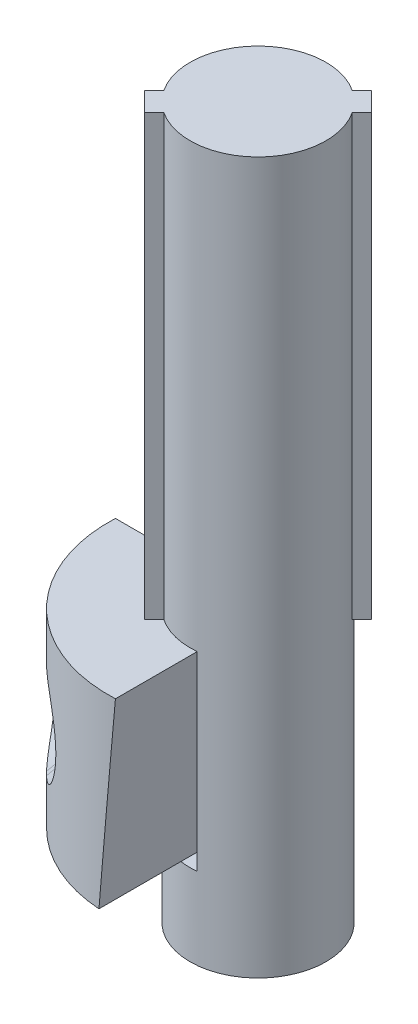
ISO-10303-21;
HEADER;
FILE_DESCRIPTION(('STEP AP214'),'2;1');
FILE_NAME('part.step','',(''),(''),'','','');
FILE_SCHEMA(('AUTOMOTIVE_DESIGN { 1 0 10303 214 1 1 1 1 }'));
ENDSEC;
DATA;
#1=APPLICATION_CONTEXT('core data for automotive mechanical design processes');
#2=APPLICATION_PROTOCOL_DEFINITION('international standard','automotive_design',2000,#1);
#3=PRODUCT_CONTEXT('',#1,'mechanical');
#4=PRODUCT('Part','Part','',(#3));
#5=PRODUCT_RELATED_PRODUCT_CATEGORY('part','',(#4));
#6=PRODUCT_DEFINITION_FORMATION('','',#4);
#7=PRODUCT_DEFINITION_CONTEXT('part definition',#1,'design');
#8=PRODUCT_DEFINITION('design','',#6,#7);
#9=PRODUCT_DEFINITION_SHAPE('','',#8);
#10=(LENGTH_UNIT() NAMED_UNIT(*) SI_UNIT(.MILLI.,.METRE.));
#11=(NAMED_UNIT(*) PLANE_ANGLE_UNIT() SI_UNIT($,.RADIAN.));
#12=(NAMED_UNIT(*) SI_UNIT($,.STERADIAN.) SOLID_ANGLE_UNIT());
#13=UNCERTAINTY_MEASURE_WITH_UNIT(LENGTH_MEASURE(1.E-05),#10,'distance_accuracy_value','');
#14=(GEOMETRIC_REPRESENTATION_CONTEXT(3) GLOBAL_UNCERTAINTY_ASSIGNED_CONTEXT((#13)) GLOBAL_UNIT_ASSIGNED_CONTEXT((#10,
#11,#12)) REPRESENTATION_CONTEXT('',''));
#15=CARTESIAN_POINT('',(0.,0.,0.));
#16=DIRECTION('',(0.,0.,1.));
#17=DIRECTION('',(1.,0.,0.));
#18=AXIS2_PLACEMENT_3D('',#15,#16,#17);
#19=CARTESIAN_POINT('',(5.5,15.,-5.5));
#20=DIRECTION('',(0.,-1.,0.));
#21=DIRECTION('',(0.,0.,-1.));
#22=AXIS2_PLACEMENT_3D('',#19,#20,#21);
#23=CYLINDRICAL_SURFACE('',#22,2.5);
#24=CARTESIAN_POINT('',(5.5,11.15,-5.5));
#25=DIRECTION('',(0.,1.,0.));
#26=DIRECTION('',(0.,0.,1.));
#27=AXIS2_PLACEMENT_3D('',#24,#25,#26);
#28=CIRCLE('',#27,2.5);
#29=CARTESIAN_POINT('',(6.87849741697561,11.15,-7.58560419816214));
#30=VERTEX_POINT('',#29);
#31=CARTESIAN_POINT('',(3.41439580183784,11.15,-4.12150258302441));
#32=VERTEX_POINT('',#31);
#33=EDGE_CURVE('E361',#30,#32,#28,.T.);
#34=ORIENTED_EDGE('',*,*,#33,.F.);
#35=DIRECTION('',(0.,1.,0.));
#36=VECTOR('',#35,1.);
#37=CARTESIAN_POINT('',(6.87849741697561,-6.50000000000001,-7.58560419816214));
#38=LINE('',#37,#36);
#39=CARTESIAN_POINT('',(6.87849741697561,-5.,-7.58560419816214));
#40=VERTEX_POINT('',#39);
#41=EDGE_CURVE('E335',#40,#30,#38,.T.);
#42=ORIENTED_EDGE('',*,*,#41,.F.);
#43=CARTESIAN_POINT('',(5.5,-5.,-5.5));
#44=DIRECTION('',(0.,1.,0.));
#45=DIRECTION('',(0.,0.,1.));
#46=AXIS2_PLACEMENT_3D('',#43,#44,#45);
#47=CIRCLE('',#46,2.5);
#48=CARTESIAN_POINT('',(7.58560419816216,-5.,-6.8784974169756));
#49=VERTEX_POINT('',#48);
#50=EDGE_CURVE('E337',#40,#49,#47,.F.);
#51=ORIENTED_EDGE('',*,*,#50,.T.);
#52=DIRECTION('',(0.,1.,0.));
#53=VECTOR('',#52,1.);
#54=CARTESIAN_POINT('',(7.58560419816216,-6.50000000000001,-6.8784974169756));
#55=LINE('',#54,#53);
#56=CARTESIAN_POINT('',(7.58560419816216,11.15,-6.8784974169756));
#57=VERTEX_POINT('',#56);
#58=EDGE_CURVE('E346',#49,#57,#55,.T.);
#59=ORIENTED_EDGE('',*,*,#58,.T.);
#60=CARTESIAN_POINT('',(4.12150258302438,11.15,-3.41439580183786));
#61=VERTEX_POINT('',#60);
#62=EDGE_CURVE('E382',#61,#57,#28,.T.);
#63=ORIENTED_EDGE('',*,*,#62,.F.);
#64=DIRECTION('',(0.,1.,0.));
#65=VECTOR('',#64,1.);
#66=CARTESIAN_POINT('',(4.12150258302438,-6.50000000000001,-3.41439580183786));
#67=LINE('',#66,#65);
#68=CARTESIAN_POINT('',(4.12150258302438,-5.,-3.41439580183786));
#69=VERTEX_POINT('',#68);
#70=EDGE_CURVE('E374',#69,#61,#67,.T.);
#71=ORIENTED_EDGE('',*,*,#70,.F.);
#72=CARTESIAN_POINT('',(5.5,-5.,-5.5));
#73=DIRECTION('',(0.,1.,0.));
#74=DIRECTION('',(0.,0.,1.));
#75=AXIS2_PLACEMENT_3D('',#72,#73,#74);
#76=CIRCLE('',#75,2.5);
#77=CARTESIAN_POINT('',(5.75,-5.,-3.01253140723345));
#78=VERTEX_POINT('',#77);
#79=EDGE_CURVE('E427',#69,#78,#76,.T.);
#80=ORIENTED_EDGE('',*,*,#79,.T.);
#81=DIRECTION('',(0.,-1.,0.));
#82=VECTOR('',#81,1.);
#83=CARTESIAN_POINT('',(5.75,15.,-3.01253140723345));
#84=LINE('',#83,#82);
#85=CARTESIAN_POINT('',(5.75,-12.,-3.01253140723345));
#86=VERTEX_POINT('',#85);
#87=EDGE_CURVE('E440',#78,#86,#84,.T.);
#88=ORIENTED_EDGE('',*,*,#87,.T.);
#89=CARTESIAN_POINT('',(5.5,-12.,-5.5));
#90=DIRECTION('',(0.,1.,0.));
#91=DIRECTION('',(0.,0.,1.));
#92=AXIS2_PLACEMENT_3D('',#89,#90,#91);
#93=CIRCLE('',#92,2.5);
#94=CARTESIAN_POINT('',(5.13757935531858,-12.,-3.0264092342692));
#95=VERTEX_POINT('',#94);
#96=EDGE_CURVE('E421',#95,#86,#93,.T.);
#97=ORIENTED_EDGE('',*,*,#96,.F.);
#98=CARTESIAN_POINT('',(3.02640923426919,-12.,-5.13757935531858));
#99=VERTEX_POINT('',#98);
#100=EDGE_CURVE('E425',#99,#95,#93,.T.);
#101=ORIENTED_EDGE('',*,*,#100,.F.);
#102=CARTESIAN_POINT('',(3.01253140723345,-12.,-5.75));
#103=VERTEX_POINT('',#102);
#104=EDGE_CURVE('E422',#103,#99,#93,.T.);
#105=ORIENTED_EDGE('',*,*,#104,.F.);
#106=DIRECTION('',(0.,-1.,0.));
#107=VECTOR('',#106,1.);
#108=CARTESIAN_POINT('',(3.01253140723345,15.,-5.75));
#109=LINE('',#108,#107);
#110=CARTESIAN_POINT('',(3.01253140723345,-5.,-5.75));
#111=VERTEX_POINT('',#110);
#112=EDGE_CURVE('E443',#111,#103,#109,.T.);
#113=ORIENTED_EDGE('',*,*,#112,.F.);
#114=CARTESIAN_POINT('',(3.41439580183784,-5.,-4.12150258302441));
#115=VERTEX_POINT('',#114);
#116=EDGE_CURVE('E428',#111,#115,#76,.T.);
#117=ORIENTED_EDGE('',*,*,#116,.T.);
#118=DIRECTION('',(0.,1.,0.));
#119=VECTOR('',#118,1.);
#120=CARTESIAN_POINT('',(3.41439580183784,-6.50000000000001,-4.12150258302441));
#121=LINE('',#120,#119);
#122=EDGE_CURVE('E371',#115,#32,#121,.T.);
#123=ORIENTED_EDGE('',*,*,#122,.T.);
#124=EDGE_LOOP('',(#34,#42,#51,#59,#63,#71,#80,#88,#97,#101,#105,#113,#117,#123));
#125=FACE_BOUND('',#124,.T.);
#126=CARTESIAN_POINT('',(5.5,-15.,-5.5));
#127=DIRECTION('',(0.,1.,0.));
#128=DIRECTION('',(0.,0.,1.));
#129=AXIS2_PLACEMENT_3D('',#126,#127,#128);
#130=CIRCLE('',#129,2.5);
#131=CARTESIAN_POINT('',(5.5,-15.,-3.));
#132=VERTEX_POINT('',#131);
#133=EDGE_CURVE('E437',#132,#132,#130,.T.);
#134=ORIENTED_EDGE('',*,*,#133,.T.);
#135=EDGE_LOOP('',(#134));
#136=FACE_BOUND('',#135,.T.);
#137=ADVANCED_FACE('F115',(#125,#136),#23,.T.);
#138=CARTESIAN_POINT('',(5.5,-5.,-5.5));
#139=DIRECTION('',(0.,1.,0.));
#140=DIRECTION('',(0.,0.,1.));
#141=AXIS2_PLACEMENT_3D('',#138,#139,#140);
#142=PLANE('',#141);
#143=ORIENTED_EDGE('',*,*,#79,.F.);
#144=DIRECTION('',(0.707106781186545,0.,-0.707106781186551));
#145=VECTOR('',#144,1.);
#146=CARTESIAN_POINT('',(0.353553390593281,-5.,0.353553390593278));
#147=LINE('',#146,#145);
#148=CARTESIAN_POINT('',(3.76794919243111,-5.,-3.06084241124458));
#149=VERTEX_POINT('',#148);
#150=EDGE_CURVE('E356',#149,#69,#147,.T.);
#151=ORIENTED_EDGE('',*,*,#150,.F.);
#152=DIRECTION('',(0.707106781186545,0.,0.70710678118655));
#153=VECTOR('',#152,1.);
#154=CARTESIAN_POINT('',(3.41439580183786,-5.,-3.41439580183784));
#155=LINE('',#154,#153);
#156=CARTESIAN_POINT('',(3.06084241124457,-5.,-3.76794919243114));
#157=VERTEX_POINT('',#156);
#158=EDGE_CURVE('E359',#157,#149,#155,.T.);
#159=ORIENTED_EDGE('',*,*,#158,.F.);
#160=DIRECTION('',(-0.707106781186554,0.,0.707106781186541));
#161=VECTOR('',#160,1.);
#162=CARTESIAN_POINT('',(-0.353553390593315,-5.,-0.353553390593322));
#163=LINE('',#162,#161);
#164=EDGE_CURVE('E358',#115,#157,#163,.T.);
#165=ORIENTED_EDGE('',*,*,#164,.F.);
#166=ORIENTED_EDGE('',*,*,#116,.F.);
#167=DIRECTION('',(1.,0.,0.));
#168=VECTOR('',#167,1.);
#169=CARTESIAN_POINT('',(0.,-5.,-5.75));
#170=LINE('',#169,#168);
#171=CARTESIAN_POINT('',(0.00568475604102465,-5.,-5.75));
#172=VERTEX_POINT('',#171);
#173=EDGE_CURVE('E434',#172,#111,#170,.T.);
#174=ORIENTED_EDGE('',*,*,#173,.F.);
#175=CARTESIAN_POINT('',(5.5,-5.,-5.5));
#176=DIRECTION('',(0.,1.,0.));
#177=DIRECTION('',(0.,0.,1.));
#178=AXIS2_PLACEMENT_3D('',#175,#176,#177);
#179=CIRCLE('',#178,5.5);
#180=CARTESIAN_POINT('',(5.75,-5.,-0.00568475604102378));
#181=VERTEX_POINT('',#180);
#182=EDGE_CURVE('E431',#172,#181,#179,.T.);
#183=ORIENTED_EDGE('',*,*,#182,.T.);
#184=DIRECTION('',(0.,0.,1.));
#185=VECTOR('',#184,1.);
#186=CARTESIAN_POINT('',(5.75,-5.,0.));
#187=LINE('',#186,#185);
#188=EDGE_CURVE('E445',#78,#181,#187,.T.);
#189=ORIENTED_EDGE('',*,*,#188,.F.);
#190=EDGE_LOOP('',(#143,#151,#159,#165,#166,#174,#183,#189));
#191=FACE_BOUND('',#190,.T.);
#192=ADVANCED_FACE('F552',(#191),#142,.T.);
#193=CARTESIAN_POINT('',(5.5,15.,-5.5));
#194=DIRECTION('',(0.,-1.,0.));
#195=DIRECTION('',(0.,0.,-1.));
#196=AXIS2_PLACEMENT_3D('',#193,#194,#195);
#197=CYLINDRICAL_SURFACE('',#196,5.5);
#198=CARTESIAN_POINT('',(1.51914962825792,-10.2335739899343,-1.70489389900612));
#199=CARTESIAN_POINT('',(1.5441505561346,-10.2392834913056,-1.67866659017602));
#200=CARTESIAN_POINT('',(1.56956531516001,-10.2434981877934,-1.65253034782335));
#201=CARTESIAN_POINT('',(1.62106490100953,-10.248905909692,-1.60061586626911));
#202=CARTESIAN_POINT('',(1.64714962759526,-10.2500993844985,-1.57483757439111));
#203=CARTESIAN_POINT('',(1.72593792711982,-10.2491048900861,-1.49852979415537));
#204=CARTESIAN_POINT('',(1.77941182021492,-10.2423957364861,-1.44877946281233));
#205=CARTESIAN_POINT('',(1.88668818475838,-10.217262973803,-1.35281149269449));
#206=CARTESIAN_POINT('',(1.94049063341472,-10.1988401683598,-1.30659361181208));
#207=CARTESIAN_POINT('',(2.04691792161581,-10.1512250764264,-1.21852814327765));
#208=CARTESIAN_POINT('',(2.09954200447221,-10.1220260690895,-1.17668330392498));
#209=CARTESIAN_POINT('',(2.20500909366872,-10.0522463652033,-1.0957181059729));
#210=CARTESIAN_POINT('',(2.25770644418136,-10.0111301977817,-1.05687221064815));
#211=CARTESIAN_POINT('',(2.35890999965567,-9.91986073930077,-0.984756598830602));
#212=CARTESIAN_POINT('',(2.40741402337676,-9.86970278633317,-0.951489776045761));
#213=CARTESIAN_POINT('',(2.50526178245831,-9.75466441146884,-0.886385002252893));
#214=CARTESIAN_POINT('',(2.55386260313672,-9.68871353776413,-0.855322657752768));
#215=CARTESIAN_POINT('',(2.64309675175275,-9.54906945821547,-0.799907720908033));
#216=CARTESIAN_POINT('',(2.68372632365317,-9.47537262748837,-0.775558289496097));
#217=CARTESIAN_POINT('',(2.76065414543683,-9.31214534820572,-0.730489816543813));
#218=CARTESIAN_POINT('',(2.79572905154928,-9.22179631965473,-0.71063658828263));
#219=CARTESIAN_POINT('',(2.85330770588625,-9.03588251331754,-0.67857820036165));
#220=CARTESIAN_POINT('',(2.87580742387453,-8.94031607415666,-0.666375492473373));
#221=CARTESIAN_POINT('',(2.90844059972597,-8.74018813291337,-0.648794415806305));
#222=CARTESIAN_POINT('',(2.91770043453417,-8.63544030745314,-0.643897299342392));
#223=CARTESIAN_POINT('',(2.92070452228868,-8.42565891314713,-0.642301352077756));
#224=CARTESIAN_POINT('',(2.91444733893316,-8.32062531874862,-0.645603280205278));
#225=CARTESIAN_POINT('',(2.88653624434314,-8.11211343729197,-0.660572485449301));
#226=CARTESIAN_POINT('',(2.8647235454944,-8.00866252399031,-0.672326045521924));
#227=CARTESIAN_POINT('',(2.806409368662,-7.80739005351634,-0.704619575411203));
#228=CARTESIAN_POINT('',(2.76990463497622,-7.7095697495621,-0.725161492759852));
#229=CARTESIAN_POINT('',(2.68386440163536,-7.52314989229976,-0.775400509268755));
#230=CARTESIAN_POINT('',(2.63441391126067,-7.43449526375924,-0.805038092132545));
#231=CARTESIAN_POINT('',(2.52411359827292,-7.26879443998814,-0.874167995886463));
#232=CARTESIAN_POINT('',(2.46326506441473,-7.19174693413775,-0.913659202813715));
#233=CARTESIAN_POINT('',(2.33654741312632,-7.05714505905393,-1.00021400074501));
#234=CARTESIAN_POINT('',(2.27123044693211,-6.9986728086022,-1.04664938640178));
#235=CARTESIAN_POINT('',(2.13511253629451,-6.89833641348128,-1.14859693861243));
#236=CARTESIAN_POINT('',(2.06431898326498,-6.8564503352752,-1.20409697988086));
#237=CARTESIAN_POINT('',(1.93090929832068,-6.7969690332752,-1.31455008805665));
#238=CARTESIAN_POINT('',(1.86857776648569,-6.77675033626925,-1.36843844380228));
#239=CARTESIAN_POINT('',(1.74482722089092,-6.75217578223954,-1.4805975427642));
#240=CARTESIAN_POINT('',(1.68340642668508,-6.74778326014308,-1.53885783698613));
#241=CARTESIAN_POINT('',(1.60594980865659,-6.75252516270229,-1.6157994927089));
#242=CARTESIAN_POINT('',(1.58833074268475,-6.75432677551555,-1.63354547723863));
#243=CARTESIAN_POINT('',(1.55346265189526,-6.75933228402285,-1.66914402065434));
#244=CARTESIAN_POINT('',(1.536213057813,-6.76253383091712,-1.68699635183818));
#245=CARTESIAN_POINT('',(1.51914962825792,-6.76642601006575,-1.70489389900612));
#246=B_SPLINE_CURVE_WITH_KNOTS('',3,(#198,#199,#200,#201,#202,#203,#204,#205,#206,#207,#208,
#209,#210,#211,#212,#213,#214,#215,#216,#217,#218,#219,#220,#221,#222,#223,#224,#225,#226,#227,
#228,#229,#230,#231,#232,#233,#234,#235,#236,#237,#238,#239,#240,#241,#242,#243,#244,#245),
.UNSPECIFIED.,.F.,.F.,(4,2,2,2,2,2,2,2,2,2,2,2,2,2,2,2,2,2,2,2,2,2,2,4),(0.,0.109979061343247,
0.219941762743246,0.438840845557283,0.657724911955656,0.876745722182427,1.10775388751094,
1.33888150217557,1.6006840341744,1.86260963230181,2.15811962417806,2.45372427015605,
2.76805399604422,3.08241281832241,3.40002734982218,3.71771230234662,4.03336131417142,
4.34897465768872,4.64484529497772,4.94032335606108,5.19339395243985,5.44587787264425,
5.52106498005335,5.59612642020038),.UNSPECIFIED.);
#247=CARTESIAN_POINT('',(1.68226625907396,-10.2496010911638,-1.54084490283661));
#248=VERTEX_POINT('',#247);
#249=CARTESIAN_POINT('',(1.68226625907396,-6.75039890883617,-1.54084490283661));
#250=VERTEX_POINT('',#249);
#251=EDGE_CURVE('E13',#248,#250,#246,.T.);
#252=ORIENTED_EDGE('',*,*,#251,.F.);
#253=CARTESIAN_POINT('',(5.5,-4.75051025721682,-5.5));
#254=DIRECTION('',(0.499999999999988,-0.707106781186548,-0.500000000000012));
#255=DIRECTION('',(-0.499999999999988,-0.707106781186547,0.500000000000012));
#256=AXIS2_PLACEMENT_3D('',#253,#254,#255);
#257=ELLIPSE('',#256,7.77817459305202,5.5);
#258=CARTESIAN_POINT('',(1.54084490283665,-10.2496010911638,-1.68226625907391));
#259=VERTEX_POINT('',#258);
#260=EDGE_CURVE('E457',#259,#248,#257,.F.);
#261=ORIENTED_EDGE('',*,*,#260,.F.);
#262=CARTESIAN_POINT('',(1.70489389900617,-6.76642601006574,-1.51914962825787));
#263=CARTESIAN_POINT('',(1.67866659017607,-6.76071650869439,-1.54415055613455));
#264=CARTESIAN_POINT('',(1.6525303478234,-6.75650181220663,-1.56956531515997));
#265=CARTESIAN_POINT('',(1.60061586626916,-6.75109409030798,-1.62106490100948));
#266=CARTESIAN_POINT('',(1.57483757439116,-6.74990061550146,-1.64714962759521));
#267=CARTESIAN_POINT('',(1.49852979415542,-6.7508951099139,-1.72593792711977));
#268=CARTESIAN_POINT('',(1.44877946281238,-6.75760426351392,-1.77941182021487));
#269=CARTESIAN_POINT('',(1.35281149269453,-6.78273702619702,-1.88668818475833));
#270=CARTESIAN_POINT('',(1.30659361181213,-6.80115983164018,-1.94049063341466));
#271=CARTESIAN_POINT('',(1.21852814327769,-6.84877492357363,-2.04691792161576));
#272=CARTESIAN_POINT('',(1.17668330392502,-6.87797393091055,-2.09954200447216));
#273=CARTESIAN_POINT('',(1.09571810597295,-6.94775363479675,-2.20500909366866));
#274=CARTESIAN_POINT('',(1.05687221064819,-6.98886980221838,-2.2577064441813));
#275=CARTESIAN_POINT('',(0.984756598830643,-7.08013926069927,-2.35890999965561));
#276=CARTESIAN_POINT('',(0.951489776045803,-7.13029721366687,-2.4074140233767));
#277=CARTESIAN_POINT('',(0.886385002252934,-7.24533558853121,-2.50526178245825));
#278=CARTESIAN_POINT('',(0.855322657752807,-7.31128646223591,-2.55386260313666));
#279=CARTESIAN_POINT('',(0.799907720908071,-7.45093054178458,-2.64309675175268));
#280=CARTESIAN_POINT('',(0.775558289496135,-7.52462737251169,-2.68372632365311));
#281=CARTESIAN_POINT('',(0.730489816543853,-7.68785465179435,-2.76065414543676));
#282=CARTESIAN_POINT('',(0.710636588282672,-7.77820368034534,-2.79572905154921));
#283=CARTESIAN_POINT('',(0.678578200361693,-7.96411748668254,-2.85330770588617));
#284=CARTESIAN_POINT('',(0.666375492473416,-8.05968392584342,-2.87580742387445));
#285=CARTESIAN_POINT('',(0.64879441580635,-8.25981186708671,-2.90844059972588));
#286=CARTESIAN_POINT('',(0.64389729934244,-8.36455969254693,-2.91770043453408));
#287=CARTESIAN_POINT('',(0.642301352077808,-8.57434108685295,-2.92070452228858));
#288=CARTESIAN_POINT('',(0.645603280205331,-8.67937468125146,-2.91444733893306));
#289=CARTESIAN_POINT('',(0.66057248544936,-8.8878865627081,-2.88653624434303));
#290=CARTESIAN_POINT('',(0.672326045521985,-8.99133747600976,-2.86472354549429));
#291=CARTESIAN_POINT('',(0.704619575411269,-9.19260994648372,-2.80640936866188));
#292=CARTESIAN_POINT('',(0.72516149275992,-9.29043025043796,-2.7699046349761));
#293=CARTESIAN_POINT('',(0.775400509268828,-9.47685010770029,-2.68386440163524));
#294=CARTESIAN_POINT('',(0.80503809213262,-9.56550473624081,-2.63441391126054));
#295=CARTESIAN_POINT('',(0.874167995886544,-9.73120556001191,-2.52411359827279));
#296=CARTESIAN_POINT('',(0.9136592028138,-9.80825306586229,-2.4632650644146));
#297=CARTESIAN_POINT('',(1.0002140007451,-9.9428549409461,-2.33654741312619));
#298=CARTESIAN_POINT('',(1.04664938640187,-10.0013271913978,-2.27123044693198));
#299=CARTESIAN_POINT('',(1.14859693861253,-10.1016635865187,-2.13511253629438));
#300=CARTESIAN_POINT('',(1.20409697988096,-10.1435496647248,-2.06431898326485));
#301=CARTESIAN_POINT('',(1.31455008805676,-10.2030309667248,-1.93090929832056));
#302=CARTESIAN_POINT('',(1.36843844380239,-10.2232496637308,-1.86857776648557));
#303=CARTESIAN_POINT('',(1.48059754276431,-10.2478242177605,-1.7448272208908));
#304=CARTESIAN_POINT('',(1.53885783698625,-10.2522167398569,-1.68340642668497));
#305=CARTESIAN_POINT('',(1.615799492709,-10.2474748372977,-1.60594980865649));
#306=CARTESIAN_POINT('',(1.63354547723872,-10.2456732244844,-1.58833074268466));
#307=CARTESIAN_POINT('',(1.66914402065441,-10.2406677159772,-1.55346265189519));
#308=CARTESIAN_POINT('',(1.68699635183824,-10.2374661690829,-1.53621305781294));
#309=CARTESIAN_POINT('',(1.70489389900617,-10.2335739899343,-1.51914962825787));
#310=B_SPLINE_CURVE_WITH_KNOTS('',3,(#262,#263,#264,#265,#266,#267,#268,#269,#270,#271,#272,
#273,#274,#275,#276,#277,#278,#279,#280,#281,#282,#283,#284,#285,#286,#287,#288,#289,#290,#291,
#292,#293,#294,#295,#296,#297,#298,#299,#300,#301,#302,#303,#304,#305,#306,#307,#308,#309),
.UNSPECIFIED.,.F.,.F.,(4,2,2,2,2,2,2,2,2,2,2,2,2,2,2,2,2,2,2,2,2,2,2,4),(0.,0.109979061343247,
0.219941762743246,0.438840845557284,0.657724911955657,0.87674572218243,1.10775388751094,
1.33888150217558,1.60068403417441,1.86260963230183,2.15811962417809,2.45372427015608,
2.76805399604425,3.08241281832244,3.4000273498222,3.71771230234664,4.03336131417143,
4.34897465768873,4.64484529497773,4.94032335606109,5.19339395243985,5.44587787264425,
5.52106498005331,5.5961264202003),.UNSPECIFIED.);
#311=CARTESIAN_POINT('',(1.54084490283665,-6.75039890883618,-1.68226625907391));
#312=VERTEX_POINT('',#311);
#313=EDGE_CURVE('E450',#312,#259,#310,.T.);
#314=ORIENTED_EDGE('',*,*,#313,.F.);
#315=CARTESIAN_POINT('',(5.5,-12.2494897427832,-5.5));
#316=DIRECTION('',(-0.499999999999988,-0.707106781186548,0.500000000000012));
#317=DIRECTION('',(0.499999999999988,-0.707106781186547,-0.500000000000012));
#318=AXIS2_PLACEMENT_3D('',#315,#316,#317);
#319=ELLIPSE('',#318,7.77817459305202,5.5);
#320=EDGE_CURVE('E127',#312,#250,#319,.F.);
#321=ORIENTED_EDGE('',*,*,#320,.T.);
#322=EDGE_LOOP('',(#252,#261,#314,#321));
#323=FACE_BOUND('',#322,.T.);
#324=CARTESIAN_POINT('',(5.5,-7.85751307569057,-5.5));
#325=DIRECTION('',(0.,0.0871557427476513,0.996194698091746));
#326=DIRECTION('',(0.,-0.996194698091746,0.0871557427476513));
#327=AXIS2_PLACEMENT_3D('',#324,#325,#326);
#328=ELLIPSE('',#327,63.1054228511892,5.5);
#329=CARTESIAN_POINT('',(0.011953783329746,-12.,-5.13757935531858));
#330=VERTEX_POINT('',#329);
#331=EDGE_CURVE('E401',#330,#172,#328,.F.);
#332=ORIENTED_EDGE('',*,*,#331,.F.);
#333=CARTESIAN_POINT('',(5.5,-12.,-5.5));
#334=DIRECTION('',(0.,1.,0.));
#335=DIRECTION('',(0.,0.,1.));
#336=AXIS2_PLACEMENT_3D('',#333,#334,#335);
#337=CIRCLE('',#336,5.5);
#338=CARTESIAN_POINT('',(5.13757935531858,-12.,-0.0119537833297451));
#339=VERTEX_POINT('',#338);
#340=EDGE_CURVE('E424',#330,#339,#337,.T.);
#341=ORIENTED_EDGE('',*,*,#340,.T.);
#342=CARTESIAN_POINT('',(5.5,-7.85751307569059,-5.5));
#343=DIRECTION('',(0.996194698091746,-0.0871557427476513,0.));
#344=DIRECTION('',(-0.0871557427476513,-0.996194698091746,0.));
#345=AXIS2_PLACEMENT_3D('',#342,#343,#344);
#346=ELLIPSE('',#345,63.1054228511892,5.5);
#347=EDGE_CURVE('E418',#339,#181,#346,.F.);
#348=ORIENTED_EDGE('',*,*,#347,.T.);
#349=ORIENTED_EDGE('',*,*,#182,.F.);
#350=EDGE_LOOP('',(#332,#341,#348,#349));
#351=FACE_BOUND('',#350,.T.);
#352=ADVANCED_FACE('F458',(#323,#351),#197,.T.);
#353=CARTESIAN_POINT('',(5.5,-12.,-5.5));
#354=DIRECTION('',(0.,1.,0.));
#355=DIRECTION('',(0.,0.,1.));
#356=AXIS2_PLACEMENT_3D('',#353,#354,#355);
#357=PLANE('',#356);
#358=ORIENTED_EDGE('',*,*,#340,.F.);
#359=DIRECTION('',(1.,0.,0.));
#360=VECTOR('',#359,1.);
#361=CARTESIAN_POINT('',(-2.49431524395898,-12.,-5.13757935531858));
#362=LINE('',#361,#360);
#363=EDGE_CURVE('E397',#330,#99,#362,.T.);
#364=ORIENTED_EDGE('',*,*,#363,.T.);
#365=ORIENTED_EDGE('',*,*,#100,.T.);
#366=DIRECTION('',(0.,0.,-1.));
#367=VECTOR('',#366,1.);
#368=CARTESIAN_POINT('',(5.13757935531858,-12.,-5.5));
#369=LINE('',#368,#367);
#370=EDGE_CURVE('E447',#339,#95,#369,.T.);
#371=ORIENTED_EDGE('',*,*,#370,.F.);
#372=EDGE_LOOP('',(#358,#364,#365,#371));
#373=FACE_BOUND('',#372,.T.);
#374=ADVANCED_FACE('F548',(#373),#357,.F.);
#375=CARTESIAN_POINT('',(0.,-15.,0.));
#376=DIRECTION('',(0.,1.,0.));
#377=DIRECTION('',(0.,0.,1.));
#378=AXIS2_PLACEMENT_3D('',#375,#376,#377);
#379=PLANE('',#378);
#380=ORIENTED_EDGE('',*,*,#133,.F.);
#381=EDGE_LOOP('',(#380));
#382=FACE_BOUND('',#381,.T.);
#383=ADVANCED_FACE('F540',(#382),#379,.F.);
#384=CARTESIAN_POINT('',(5.13757935531858,-12.,0.244315243958976));
#385=DIRECTION('',(0.,1.,0.));
#386=DIRECTION('',(0.,0.,1.));
#387=AXIS2_PLACEMENT_3D('',#384,#385,#386);
#388=PLANE('',#387);
#389=ORIENTED_EDGE('',*,*,#96,.T.);
#390=DIRECTION('',(0.,0.,-1.));
#391=VECTOR('',#390,1.);
#392=CARTESIAN_POINT('',(5.75,-12.,0.244315243958976));
#393=LINE('',#392,#391);
#394=CARTESIAN_POINT('',(5.75,-12.,-4.00568475604102));
#395=VERTEX_POINT('',#394);
#396=EDGE_CURVE('E412',#86,#395,#393,.T.);
#397=ORIENTED_EDGE('',*,*,#396,.T.);
#398=DIRECTION('',(1.,0.,0.));
#399=VECTOR('',#398,1.);
#400=CARTESIAN_POINT('',(5.13757935531858,-12.,-4.00568475604102));
#401=LINE('',#400,#399);
#402=CARTESIAN_POINT('',(5.13757935531858,-12.,-4.00568475604102));
#403=VERTEX_POINT('',#402);
#404=EDGE_CURVE('E409',#403,#395,#401,.T.);
#405=ORIENTED_EDGE('',*,*,#404,.F.);
#406=DIRECTION('',(0.,0.,-1.));
#407=VECTOR('',#406,1.);
#408=CARTESIAN_POINT('',(5.13757935531858,-12.,0.244315243958976));
#409=LINE('',#408,#407);
#410=EDGE_CURVE('E414',#95,#403,#409,.T.);
#411=ORIENTED_EDGE('',*,*,#410,.F.);
#412=EDGE_LOOP('',(#389,#397,#405,#411));
#413=FACE_BOUND('',#412,.T.);
#414=ADVANCED_FACE('F536',(#413),#388,.T.);
#415=CARTESIAN_POINT('',(5.75,-12.,0.244315243958976));
#416=DIRECTION('',(-1.,0.,0.));
#417=DIRECTION('',(0.,0.,1.));
#418=AXIS2_PLACEMENT_3D('',#415,#416,#417);
#419=PLANE('',#418);
#420=ORIENTED_EDGE('',*,*,#87,.F.);
#421=DIRECTION('',(0.,0.,-1.));
#422=VECTOR('',#421,1.);
#423=CARTESIAN_POINT('',(5.75,-5.,0.244315243958976));
#424=LINE('',#423,#422);
#425=CARTESIAN_POINT('',(5.75,-5.,-4.00568475604102));
#426=VERTEX_POINT('',#425);
#427=EDGE_CURVE('E416',#78,#426,#424,.T.);
#428=ORIENTED_EDGE('',*,*,#427,.T.);
#429=DIRECTION('',(0.,1.,0.));
#430=VECTOR('',#429,1.);
#431=CARTESIAN_POINT('',(5.75,-12.,-4.00568475604102));
#432=LINE('',#431,#430);
#433=EDGE_CURVE('E403',#395,#426,#432,.T.);
#434=ORIENTED_EDGE('',*,*,#433,.F.);
#435=ORIENTED_EDGE('',*,*,#396,.F.);
#436=EDGE_LOOP('',(#420,#428,#434,#435));
#437=FACE_BOUND('',#436,.T.);
#438=ADVANCED_FACE('F539',(#437),#419,.T.);
#439=CARTESIAN_POINT('',(5.75,-5.,0.244315243958976));
#440=DIRECTION('',(0.996194698091746,-0.0871557427476513,0.));
#441=DIRECTION('',(0.0871557427476513,0.996194698091746,0.));
#442=AXIS2_PLACEMENT_3D('',#439,#440,#441);
#443=PLANE('',#442);
#444=ORIENTED_EDGE('',*,*,#370,.T.);
#445=ORIENTED_EDGE('',*,*,#410,.T.);
#446=DIRECTION('',(-0.0871557427476513,-0.996194698091746,0.));
#447=VECTOR('',#446,1.);
#448=CARTESIAN_POINT('',(5.75,-5.,-4.00568475604102));
#449=LINE('',#448,#447);
#450=EDGE_CURVE('E406',#426,#403,#449,.T.);
#451=ORIENTED_EDGE('',*,*,#450,.F.);
#452=ORIENTED_EDGE('',*,*,#427,.F.);
#453=ORIENTED_EDGE('',*,*,#188,.T.);
#454=ORIENTED_EDGE('',*,*,#347,.F.);
#455=EDGE_LOOP('',(#444,#445,#451,#452,#453,#454));
#456=FACE_BOUND('',#455,.T.);
#457=ADVANCED_FACE('F534',(#456),#443,.T.);
#458=CARTESIAN_POINT('',(0.,0.,-4.00568475604102));
#459=DIRECTION('',(0.,0.,-1.));
#460=DIRECTION('',(-1.,0.,0.));
#461=AXIS2_PLACEMENT_3D('',#458,#459,#460);
#462=PLANE('',#461);
#463=ORIENTED_EDGE('',*,*,#433,.T.);
#464=ORIENTED_EDGE('',*,*,#450,.T.);
#465=ORIENTED_EDGE('',*,*,#404,.T.);
#466=EDGE_LOOP('',(#463,#464,#465));
#467=FACE_BOUND('',#466,.T.);
#468=ADVANCED_FACE('F530',(#467),#462,.F.);
#469=CARTESIAN_POINT('',(-2.49431524395898,-12.,-5.13757935531858));
#470=DIRECTION('',(0.,-1.,0.));
#471=DIRECTION('',(0.,0.,-1.));
#472=AXIS2_PLACEMENT_3D('',#469,#470,#471);
#473=PLANE('',#472);
#474=CARTESIAN_POINT('',(4.00568475604102,-12.,-5.13757935531858));
#475=VERTEX_POINT('',#474);
#476=EDGE_CURVE('E395',#99,#475,#362,.T.);
#477=ORIENTED_EDGE('',*,*,#476,.T.);
#478=DIRECTION('',(0.,0.,-1.));
#479=VECTOR('',#478,1.);
#480=CARTESIAN_POINT('',(4.00568475604102,-12.,-5.13757935531858));
#481=LINE('',#480,#479);
#482=CARTESIAN_POINT('',(4.00568475604102,-12.,-5.75));
#483=VERTEX_POINT('',#482);
#484=EDGE_CURVE('E385',#475,#483,#481,.T.);
#485=ORIENTED_EDGE('',*,*,#484,.T.);
#486=DIRECTION('',(1.,0.,0.));
#487=VECTOR('',#486,1.);
#488=CARTESIAN_POINT('',(-2.49431524395898,-12.,-5.75));
#489=LINE('',#488,#487);
#490=EDGE_CURVE('E394',#103,#483,#489,.T.);
#491=ORIENTED_EDGE('',*,*,#490,.F.);
#492=ORIENTED_EDGE('',*,*,#104,.T.);
#493=EDGE_LOOP('',(#477,#485,#491,#492));
#494=FACE_BOUND('',#493,.T.);
#495=ADVANCED_FACE('F526',(#494),#473,.F.);
#496=CARTESIAN_POINT('',(-2.49431524395898,-12.,-5.75));
#497=DIRECTION('',(0.,0.,-1.));
#498=DIRECTION('',(-1.,0.,0.));
#499=AXIS2_PLACEMENT_3D('',#496,#497,#498);
#500=PLANE('',#499);
#501=ORIENTED_EDGE('',*,*,#490,.T.);
#502=DIRECTION('',(0.,1.,0.));
#503=VECTOR('',#502,1.);
#504=CARTESIAN_POINT('',(4.00568475604102,-12.,-5.75));
#505=LINE('',#504,#503);
#506=CARTESIAN_POINT('',(4.00568475604102,-5.,-5.75));
#507=VERTEX_POINT('',#506);
#508=EDGE_CURVE('E388',#483,#507,#505,.T.);
#509=ORIENTED_EDGE('',*,*,#508,.T.);
#510=DIRECTION('',(1.,0.,0.));
#511=VECTOR('',#510,1.);
#512=CARTESIAN_POINT('',(-2.49431524395898,-5.,-5.75));
#513=LINE('',#512,#511);
#514=EDGE_CURVE('E398',#111,#507,#513,.T.);
#515=ORIENTED_EDGE('',*,*,#514,.F.);
#516=ORIENTED_EDGE('',*,*,#112,.T.);
#517=EDGE_LOOP('',(#501,#509,#515,#516));
#518=FACE_BOUND('',#517,.T.);
#519=ADVANCED_FACE('F522',(#518),#500,.F.);
#520=CARTESIAN_POINT('',(-2.49431524395898,-5.,-5.75));
#521=DIRECTION('',(0.,0.0871557427476513,0.996194698091746));
#522=DIRECTION('',(0.,-0.996194698091746,0.0871557427476513));
#523=AXIS2_PLACEMENT_3D('',#520,#521,#522);
#524=PLANE('',#523);
#525=ORIENTED_EDGE('',*,*,#331,.T.);
#526=ORIENTED_EDGE('',*,*,#173,.T.);
#527=ORIENTED_EDGE('',*,*,#514,.T.);
#528=DIRECTION('',(0.,-0.996194698091746,0.0871557427476513));
#529=VECTOR('',#528,1.);
#530=CARTESIAN_POINT('',(4.00568475604102,-5.,-5.75));
#531=LINE('',#530,#529);
#532=EDGE_CURVE('E391',#507,#475,#531,.T.);
#533=ORIENTED_EDGE('',*,*,#532,.T.);
#534=ORIENTED_EDGE('',*,*,#476,.F.);
#535=ORIENTED_EDGE('',*,*,#363,.F.);
#536=EDGE_LOOP('',(#525,#526,#527,#533,#534,#535));
#537=FACE_BOUND('',#536,.T.);
#538=ADVANCED_FACE('F518',(#537),#524,.F.);
#539=CARTESIAN_POINT('',(4.00568475604102,0.,0.));
#540=DIRECTION('',(1.,0.,0.));
#541=DIRECTION('',(0.,0.,-1.));
#542=AXIS2_PLACEMENT_3D('',#539,#540,#541);
#543=PLANE('',#542);
#544=ORIENTED_EDGE('',*,*,#484,.F.);
#545=ORIENTED_EDGE('',*,*,#532,.F.);
#546=ORIENTED_EDGE('',*,*,#508,.F.);
#547=EDGE_LOOP('',(#544,#545,#546));
#548=FACE_BOUND('',#547,.T.);
#549=ADVANCED_FACE('F515',(#548),#543,.F.);
#550=CARTESIAN_POINT('',(5.5,11.15,-5.5));
#551=DIRECTION('',(0.,1.,0.));
#552=DIRECTION('',(0.,0.,1.));
#553=AXIS2_PLACEMENT_3D('',#550,#551,#552);
#554=PLANE('',#553);
#555=ORIENTED_EDGE('',*,*,#62,.T.);
#556=DIRECTION('',(0.707106781186551,0.,-0.707106781186544));
#557=VECTOR('',#556,1.);
#558=CARTESIAN_POINT('',(0.353553390593242,11.15,0.353553390593246));
#559=LINE('',#558,#557);
#560=CARTESIAN_POINT('',(7.93915758875545,11.15,-7.23205080756888));
#561=VERTEX_POINT('',#560);
#562=EDGE_CURVE('E331',#57,#561,#559,.T.);
#563=ORIENTED_EDGE('',*,*,#562,.T.);
#564=DIRECTION('',(-0.707106781186557,0.,-0.707106781186538));
#565=VECTOR('',#564,1.);
#566=CARTESIAN_POINT('',(7.58560419816206,11.15,-7.58560419816226));
#567=LINE('',#566,#565);
#568=CARTESIAN_POINT('',(7.23205080756889,11.15,-7.93915758875542));
#569=VERTEX_POINT('',#568);
#570=EDGE_CURVE('E343',#561,#569,#567,.T.);
#571=ORIENTED_EDGE('',*,*,#570,.T.);
#572=DIRECTION('',(-0.707106781186551,0.,0.707106781186544));
#573=VECTOR('',#572,1.);
#574=CARTESIAN_POINT('',(-0.3535533905933,11.15,-0.353553390593303));
#575=LINE('',#574,#573);
#576=EDGE_CURVE('E142',#569,#30,#575,.T.);
#577=ORIENTED_EDGE('',*,*,#576,.T.);
#578=ORIENTED_EDGE('',*,*,#33,.T.);
#579=DIRECTION('',(0.707106781186554,0.,-0.707106781186541));
#580=VECTOR('',#579,1.);
#581=CARTESIAN_POINT('',(-0.353553390593315,11.15,-0.353553390593322));
#582=LINE('',#581,#580);
#583=CARTESIAN_POINT('',(3.06084241124457,11.15,-3.76794919243114));
#584=VERTEX_POINT('',#583);
#585=EDGE_CURVE('E355',#584,#32,#582,.T.);
#586=ORIENTED_EDGE('',*,*,#585,.F.);
#587=DIRECTION('',(-0.707106781186545,0.,-0.70710678118655));
#588=VECTOR('',#587,1.);
#589=CARTESIAN_POINT('',(3.41439580183786,11.15,-3.41439580183784));
#590=LINE('',#589,#588);
#591=CARTESIAN_POINT('',(3.76794919243111,11.15,-3.06084241124458));
#592=VERTEX_POINT('',#591);
#593=EDGE_CURVE('E364',#592,#584,#590,.T.);
#594=ORIENTED_EDGE('',*,*,#593,.F.);
#595=DIRECTION('',(-0.707106781186545,0.,0.707106781186551));
#596=VECTOR('',#595,1.);
#597=CARTESIAN_POINT('',(0.353553390593281,11.15,0.353553390593278));
#598=LINE('',#597,#596);
#599=EDGE_CURVE('E367',#61,#592,#598,.T.);
#600=ORIENTED_EDGE('',*,*,#599,.F.);
#601=EDGE_LOOP('',(#555,#563,#571,#577,#578,#586,#594,#600));
#602=FACE_BOUND('',#601,.T.);
#603=ADVANCED_FACE('F508',(#602),#554,.T.);
#604=CARTESIAN_POINT('',(3.41439580183786,-6.50000000000001,-3.41439580183784));
#605=DIRECTION('',(0.70710678118655,0.,-0.707106781186545));
#606=DIRECTION('',(-0.707106781186545,0.,-0.70710678118655));
#607=AXIS2_PLACEMENT_3D('',#604,#605,#606);
#608=PLANE('',#607);
#609=DIRECTION('',(0.,1.,0.));
#610=VECTOR('',#609,1.);
#611=CARTESIAN_POINT('',(3.06084241124457,-6.50000000000001,-3.76794919243114));
#612=LINE('',#611,#610);
#613=EDGE_CURVE('E370',#157,#584,#612,.T.);
#614=ORIENTED_EDGE('',*,*,#613,.F.);
#615=ORIENTED_EDGE('',*,*,#158,.T.);
#616=DIRECTION('',(0.,1.,0.));
#617=VECTOR('',#616,1.);
#618=CARTESIAN_POINT('',(3.76794919243111,-6.50000000000001,-3.06084241124458));
#619=LINE('',#618,#617);
#620=EDGE_CURVE('E377',#149,#592,#619,.T.);
#621=ORIENTED_EDGE('',*,*,#620,.T.);
#622=ORIENTED_EDGE('',*,*,#593,.T.);
#623=EDGE_LOOP('',(#614,#615,#621,#622));
#624=FACE_BOUND('',#623,.T.);
#625=ADVANCED_FACE('F504',(#624),#608,.F.);
#626=CARTESIAN_POINT('',(0.353553390593281,-6.50000000000001,0.353553390593278));
#627=DIRECTION('',(-0.70710678118655,0.,-0.707106781186544));
#628=DIRECTION('',(-0.707106781186545,0.,0.707106781186551));
#629=AXIS2_PLACEMENT_3D('',#626,#627,#628);
#630=PLANE('',#629);
#631=ORIENTED_EDGE('',*,*,#620,.F.);
#632=ORIENTED_EDGE('',*,*,#150,.T.);
#633=ORIENTED_EDGE('',*,*,#70,.T.);
#634=ORIENTED_EDGE('',*,*,#599,.T.);
#635=EDGE_LOOP('',(#631,#632,#633,#634));
#636=FACE_BOUND('',#635,.T.);
#637=ADVANCED_FACE('F501',(#636),#630,.F.);
#638=CARTESIAN_POINT('',(-0.353553390593315,-6.50000000000001,-0.353553390593322));
#639=DIRECTION('',(0.707106781186541,0.,0.707106781186554));
#640=DIRECTION('',(0.707106781186554,0.,-0.707106781186541));
#641=AXIS2_PLACEMENT_3D('',#638,#639,#640);
#642=PLANE('',#641);
#643=ORIENTED_EDGE('',*,*,#122,.F.);
#644=ORIENTED_EDGE('',*,*,#164,.T.);
#645=ORIENTED_EDGE('',*,*,#613,.T.);
#646=ORIENTED_EDGE('',*,*,#585,.T.);
#647=EDGE_LOOP('',(#643,#644,#645,#646));
#648=FACE_BOUND('',#647,.T.);
#649=ADVANCED_FACE('F493',(#648),#642,.F.);
#650=CARTESIAN_POINT('',(-0.3535533905933,-6.50000000000001,-0.353553390593303));
#651=DIRECTION('',(-0.707106781186544,0.,-0.707106781186551));
#652=DIRECTION('',(-0.707106781186551,0.,0.707106781186544));
#653=AXIS2_PLACEMENT_3D('',#650,#651,#652);
#654=PLANE('',#653);
#655=DIRECTION('',(0.707106781186551,0.,-0.707106781186544));
#656=VECTOR('',#655,1.);
#657=CARTESIAN_POINT('',(-0.3535533905933,-5.,-0.353553390593303));
#658=LINE('',#657,#656);
#659=CARTESIAN_POINT('',(7.23205080756889,-5.,-7.93915758875542));
#660=VERTEX_POINT('',#659);
#661=EDGE_CURVE('E334',#40,#660,#658,.T.);
#662=ORIENTED_EDGE('',*,*,#661,.F.);
#663=ORIENTED_EDGE('',*,*,#41,.T.);
#664=ORIENTED_EDGE('',*,*,#576,.F.);
#665=DIRECTION('',(0.,1.,0.));
#666=VECTOR('',#665,1.);
#667=CARTESIAN_POINT('',(7.23205080756889,-6.50000000000001,-7.93915758875542));
#668=LINE('',#667,#666);
#669=EDGE_CURVE('E348',#660,#569,#668,.T.);
#670=ORIENTED_EDGE('',*,*,#669,.F.);
#671=EDGE_LOOP('',(#662,#663,#664,#670));
#672=FACE_BOUND('',#671,.T.);
#673=ADVANCED_FACE('F489',(#672),#654,.T.);
#674=CARTESIAN_POINT('',(7.58560419816206,-6.50000000000001,-7.58560419816226));
#675=DIRECTION('',(0.707106781186538,0.,-0.707106781186557));
#676=DIRECTION('',(-0.707106781186557,0.,-0.707106781186538));
#677=AXIS2_PLACEMENT_3D('',#674,#675,#676);
#678=PLANE('',#677);
#679=DIRECTION('',(0.707106781186557,0.,0.707106781186538));
#680=VECTOR('',#679,1.);
#681=CARTESIAN_POINT('',(7.58560419816206,-5.,-7.58560419816226));
#682=LINE('',#681,#680);
#683=CARTESIAN_POINT('',(7.93915758875545,-5.,-7.23205080756888));
#684=VERTEX_POINT('',#683);
#685=EDGE_CURVE('E332',#660,#684,#682,.T.);
#686=ORIENTED_EDGE('',*,*,#685,.F.);
#687=ORIENTED_EDGE('',*,*,#669,.T.);
#688=ORIENTED_EDGE('',*,*,#570,.F.);
#689=DIRECTION('',(0.,1.,0.));
#690=VECTOR('',#689,1.);
#691=CARTESIAN_POINT('',(7.93915758875545,-6.50000000000001,-7.23205080756888));
#692=LINE('',#691,#690);
#693=EDGE_CURVE('E350',#684,#561,#692,.T.);
#694=ORIENTED_EDGE('',*,*,#693,.F.);
#695=EDGE_LOOP('',(#686,#687,#688,#694));
#696=FACE_BOUND('',#695,.T.);
#697=ADVANCED_FACE('F492',(#696),#678,.T.);
#698=CARTESIAN_POINT('',(0.353553390593242,-6.50000000000001,0.353553390593246));
#699=DIRECTION('',(0.707106781186544,0.,0.707106781186551));
#700=DIRECTION('',(0.707106781186551,0.,-0.707106781186544));
#701=AXIS2_PLACEMENT_3D('',#698,#699,#700);
#702=PLANE('',#701);
#703=DIRECTION('',(-0.707106781186551,0.,0.707106781186544));
#704=VECTOR('',#703,1.);
#705=CARTESIAN_POINT('',(0.353553390593242,-5.,0.353553390593246));
#706=LINE('',#705,#704);
#707=EDGE_CURVE('E340',#684,#49,#706,.T.);
#708=ORIENTED_EDGE('',*,*,#707,.F.);
#709=ORIENTED_EDGE('',*,*,#693,.T.);
#710=ORIENTED_EDGE('',*,*,#562,.F.);
#711=ORIENTED_EDGE('',*,*,#58,.F.);
#712=EDGE_LOOP('',(#708,#709,#710,#711));
#713=FACE_BOUND('',#712,.T.);
#714=ADVANCED_FACE('F487',(#713),#702,.T.);
#715=CARTESIAN_POINT('',(5.5,-5.,-5.5));
#716=DIRECTION('',(0.,1.,0.));
#717=DIRECTION('',(0.,0.,1.));
#718=AXIS2_PLACEMENT_3D('',#715,#716,#717);
#719=PLANE('',#718);
#720=ORIENTED_EDGE('',*,*,#661,.T.);
#721=ORIENTED_EDGE('',*,*,#685,.T.);
#722=ORIENTED_EDGE('',*,*,#707,.T.);
#723=ORIENTED_EDGE('',*,*,#50,.F.);
#724=EDGE_LOOP('',(#720,#721,#722,#723));
#725=FACE_BOUND('',#724,.T.);
#726=ADVANCED_FACE('F483',(#725),#719,.F.);
#727=CARTESIAN_POINT('',(5.18216275480416,-8.5,-5.04074139856697));
#728=DIRECTION('',(-0.707106781186531,0.,0.707106781186565));
#729=DIRECTION('',(0.707106781186565,0.,0.707106781186531));
#730=AXIS2_PLACEMENT_3D('',#727,#728,#729);
#731=CONICAL_SURFACE('',#730,0.899999999999998,1.02974425867665);
#732=CARTESIAN_POINT('',(5.18216275480416,-8.5,-5.04074139856697));
#733=DIRECTION('',(-0.707106781186531,0.,0.707106781186565));
#734=DIRECTION('',(0.707106781186565,0.,0.707106781186531));
#735=AXIS2_PLACEMENT_3D('',#732,#733,#734);
#736=CIRCLE('',#735,0.899999999999998);
#737=CARTESIAN_POINT('',(5.18216275480416,-9.4,-5.04074139856697));
#738=VERTEX_POINT('',#737);
#739=CARTESIAN_POINT('',(5.18216275480416,-7.6,-5.04074139856697));
#740=VERTEX_POINT('',#739);
#741=EDGE_CURVE('E328',#738,#740,#736,.T.);
#742=ORIENTED_EDGE('',*,*,#741,.T.);
#743=DIRECTION('',(0.364186915338155,-0.857167300702113,-0.364186915338173));
#744=VECTOR('',#743,1.);
#745=CARTESIAN_POINT('',(5.56454811124025,-8.5,-5.42312675500308));
#746=LINE('',#745,#744);
#747=CARTESIAN_POINT('',(5.56454811124025,-8.5,-5.42312675500308));
#748=VERTEX_POINT('',#747);
#749=EDGE_CURVE('E323',#740,#748,#746,.T.);
#750=ORIENTED_EDGE('',*,*,#749,.T.);
#751=DIRECTION('',(-0.364186915338157,-0.857167300702111,0.364186915338175));
#752=VECTOR('',#751,1.);
#753=CARTESIAN_POINT('',(5.56454811124025,-8.5,-5.42312675500308));
#754=LINE('',#753,#752);
#755=EDGE_CURVE('E308',#738,#748,#754,.F.);
#756=ORIENTED_EDGE('',*,*,#755,.F.);
#757=EDGE_LOOP('',(#742,#750,#756));
#758=FACE_BOUND('',#757,.T.);
#759=ADVANCED_FACE('F479',(#758),#731,.F.);
#760=CARTESIAN_POINT('',(0.939522067684975,-8.5,-0.798100711447583));
#761=DIRECTION('',(-0.707106781186531,0.,0.707106781186565));
#762=DIRECTION('',(0.707106781186565,0.,0.707106781186531));
#763=AXIS2_PLACEMENT_3D('',#760,#761,#762);
#764=CYLINDRICAL_SURFACE('',#763,0.900000000000005);
#765=CARTESIAN_POINT('',(2.28302495193937,-8.5,-2.14160359570205));
#766=DIRECTION('',(-0.707106781186531,0.,0.707106781186565));
#767=DIRECTION('',(0.707106781186565,0.,0.707106781186531));
#768=AXIS2_PLACEMENT_3D('',#765,#766,#767);
#769=CIRCLE('',#768,0.900000000000012);
#770=CARTESIAN_POINT('',(2.28302495193937,-9.40000000000001,-2.14160359570205));
#771=VERTEX_POINT('',#770);
#772=CARTESIAN_POINT('',(2.28302495193937,-7.59999999999999,-2.14160359570205));
#773=VERTEX_POINT('',#772);
#774=EDGE_CURVE('E326',#771,#773,#769,.T.);
#775=ORIENTED_EDGE('',*,*,#774,.T.);
#776=DIRECTION('',(0.707106781186531,0.,-0.707106781186565));
#777=VECTOR('',#776,1.);
#778=CARTESIAN_POINT('',(5.18216275480416,-7.6,-5.04074139856697));
#779=LINE('',#778,#777);
#780=EDGE_CURVE('E289',#773,#740,#779,.T.);
#781=ORIENTED_EDGE('',*,*,#780,.T.);
#782=ORIENTED_EDGE('',*,*,#741,.F.);
#783=DIRECTION('',(-0.707106781186531,0.,0.707106781186565));
#784=VECTOR('',#783,1.);
#785=CARTESIAN_POINT('',(0.939522067684975,-9.40000000000001,-0.798100711447583));
#786=LINE('',#785,#784);
#787=EDGE_CURVE('E315',#771,#738,#786,.F.);
#788=ORIENTED_EDGE('',*,*,#787,.F.);
#789=EDGE_LOOP('',(#775,#781,#782,#788));
#790=FACE_BOUND('',#789,.T.);
#791=ADVANCED_FACE('F475',(#790),#764,.F.);
#792=CARTESIAN_POINT('',(1.6466288488715,-8.5,-1.50520749263415));
#793=DIRECTION('',(-0.707106781186531,0.,0.707106781186565));
#794=DIRECTION('',(0.707106781186565,0.,0.707106781186531));
#795=AXIS2_PLACEMENT_3D('',#792,#793,#794);
#796=CONICAL_SURFACE('',#795,1.8,0.785398163397448);
#797=ORIENTED_EDGE('',*,*,#251,.T.);
#798=DIRECTION('',(0.499999999999988,-0.707106781186548,-0.500000000000012));
#799=VECTOR('',#798,1.);
#800=CARTESIAN_POINT('',(2.28302495193937,-7.59999999999999,-2.14160359570205));
#801=LINE('',#800,#799);
#802=EDGE_CURVE('E320',#250,#773,#801,.T.);
#803=ORIENTED_EDGE('',*,*,#802,.T.);
#804=ORIENTED_EDGE('',*,*,#774,.F.);
#805=DIRECTION('',(-0.499999999999988,-0.707106781186547,0.500000000000012));
#806=VECTOR('',#805,1.);
#807=CARTESIAN_POINT('',(2.91942105500726,-8.5,-2.77799969876996));
#808=LINE('',#807,#806);
#809=EDGE_CURVE('E318',#248,#771,#808,.F.);
#810=ORIENTED_EDGE('',*,*,#809,.F.);
#811=EDGE_LOOP('',(#797,#803,#804,#810));
#812=FACE_BOUND('',#811,.T.);
#813=ADVANCED_FACE('F470',(#812),#796,.F.);
#814=CARTESIAN_POINT('',(5.04074139856685,-8.5,-5.18216275480428));
#815=DIRECTION('',(-0.707106781186531,0.,0.707106781186565));
#816=DIRECTION('',(0.707106781186565,0.,0.707106781186531));
#817=AXIS2_PLACEMENT_3D('',#814,#815,#816);
#818=CONICAL_SURFACE('',#817,0.899999999999998,1.02974425867665);
#819=DIRECTION('',(0.364186915338155,-0.857167300702113,-0.364186915338173));
#820=VECTOR('',#819,1.);
#821=CARTESIAN_POINT('',(5.42312675500294,-8.5,-5.56454811124039));
#822=LINE('',#821,#820);
#823=CARTESIAN_POINT('',(5.04074139856685,-7.6,-5.18216275480428));
#824=VERTEX_POINT('',#823);
#825=CARTESIAN_POINT('',(5.42312675500294,-8.5,-5.56454811124039));
#826=VERTEX_POINT('',#825);
#827=EDGE_CURVE('E301',#824,#826,#822,.T.);
#828=ORIENTED_EDGE('',*,*,#827,.F.);
#829=CARTESIAN_POINT('',(5.04074139856685,-8.5,-5.18216275480428));
#830=DIRECTION('',(-0.707106781186531,0.,0.707106781186565));
#831=DIRECTION('',(0.707106781186565,0.,0.707106781186531));
#832=AXIS2_PLACEMENT_3D('',#829,#830,#831);
#833=CIRCLE('',#832,0.899999999999998);
#834=CARTESIAN_POINT('',(5.04074139856684,-9.4,-5.18216275480428));
#835=VERTEX_POINT('',#834);
#836=EDGE_CURVE('E300',#824,#835,#833,.T.);
#837=ORIENTED_EDGE('',*,*,#836,.T.);
#838=DIRECTION('',(0.364186915338157,0.857167300702111,-0.364186915338175));
#839=VECTOR('',#838,1.);
#840=CARTESIAN_POINT('',(5.42312675500294,-8.5,-5.56454811124039));
#841=LINE('',#840,#839);
#842=EDGE_CURVE('E281',#826,#835,#841,.F.);
#843=ORIENTED_EDGE('',*,*,#842,.F.);
#844=EDGE_LOOP('',(#828,#837,#843));
#845=FACE_BOUND('',#844,.T.);
#846=ADVANCED_FACE('F468',(#845),#818,.F.);
#847=CARTESIAN_POINT('',(0.798100711447663,-8.5,-0.939522067684889));
#848=DIRECTION('',(-0.707106781186531,0.,0.707106781186565));
#849=DIRECTION('',(0.707106781186565,0.,0.707106781186531));
#850=AXIS2_PLACEMENT_3D('',#847,#848,#849);
#851=CYLINDRICAL_SURFACE('',#850,0.900000000000005);
#852=ORIENTED_EDGE('',*,*,#836,.F.);
#853=DIRECTION('',(0.707106781186531,0.,-0.707106781186565));
#854=VECTOR('',#853,1.);
#855=CARTESIAN_POINT('',(5.04074139856685,-7.6,-5.18216275480428));
#856=LINE('',#855,#854);
#857=CARTESIAN_POINT('',(2.14160359570206,-7.59999999999999,-2.28302495193935));
#858=VERTEX_POINT('',#857);
#859=EDGE_CURVE('E280',#858,#824,#856,.T.);
#860=ORIENTED_EDGE('',*,*,#859,.F.);
#861=CARTESIAN_POINT('',(2.14160359570206,-8.5,-2.28302495193935));
#862=DIRECTION('',(-0.707106781186531,0.,0.707106781186565));
#863=DIRECTION('',(0.707106781186565,0.,0.707106781186531));
#864=AXIS2_PLACEMENT_3D('',#861,#862,#863);
#865=CIRCLE('',#864,0.900000000000012);
#866=CARTESIAN_POINT('',(2.14160359570206,-9.40000000000001,-2.28302495193935));
#867=VERTEX_POINT('',#866);
#868=EDGE_CURVE('E298',#858,#867,#865,.T.);
#869=ORIENTED_EDGE('',*,*,#868,.T.);
#870=DIRECTION('',(-0.707106781186531,0.,0.707106781186565));
#871=VECTOR('',#870,1.);
#872=CARTESIAN_POINT('',(0.798100711447663,-9.40000000000001,-0.939522067684889));
#873=LINE('',#872,#871);
#874=EDGE_CURVE('E625',#835,#867,#873,.T.);
#875=ORIENTED_EDGE('',*,*,#874,.F.);
#876=EDGE_LOOP('',(#852,#860,#869,#875));
#877=FACE_BOUND('',#876,.T.);
#878=ADVANCED_FACE('F296',(#877),#851,.F.);
#879=CARTESIAN_POINT('',(1.50520749263419,-8.5,-1.64662884887145));
#880=DIRECTION('',(-0.707106781186531,0.,0.707106781186565));
#881=DIRECTION('',(0.707106781186565,0.,0.707106781186531));
#882=AXIS2_PLACEMENT_3D('',#879,#880,#881);
#883=CONICAL_SURFACE('',#882,1.8,0.785398163397448);
#884=ORIENTED_EDGE('',*,*,#313,.T.);
#885=DIRECTION('',(0.499999999999988,0.707106781186547,-0.500000000000012));
#886=VECTOR('',#885,1.);
#887=CARTESIAN_POINT('',(2.77799969876995,-8.5,-2.91942105500727));
#888=LINE('',#887,#886);
#889=EDGE_CURVE('E290',#867,#259,#888,.F.);
#890=ORIENTED_EDGE('',*,*,#889,.F.);
#891=ORIENTED_EDGE('',*,*,#868,.F.);
#892=DIRECTION('',(0.499999999999988,-0.707106781186548,-0.500000000000012));
#893=VECTOR('',#892,1.);
#894=CARTESIAN_POINT('',(2.14160359570206,-7.59999999999999,-2.28302495193935));
#895=LINE('',#894,#893);
#896=EDGE_CURVE('E134',#312,#858,#895,.T.);
#897=ORIENTED_EDGE('',*,*,#896,.F.);
#898=EDGE_LOOP('',(#884,#890,#891,#897));
#899=FACE_BOUND('',#898,.T.);
#900=ADVANCED_FACE('F304',(#899),#883,.F.);
#901=CARTESIAN_POINT('',(2.14160359570206,-7.59999999999999,-2.28302495193935));
#902=DIRECTION('',(-0.499999999999988,-0.707106781186548,0.500000000000012));
#903=DIRECTION('',(0.,-0.577350269189635,-0.81649658092772));
#904=AXIS2_PLACEMENT_3D('',#901,#902,#903);
#905=PLANE('',#904);
#906=ORIENTED_EDGE('',*,*,#896,.T.);
#907=DIRECTION('',(0.707106781186564,0.,0.707106781186531));
#908=VECTOR('',#907,1.);
#909=CARTESIAN_POINT('',(2.14160359570206,-7.59999999999999,-2.28302495193935));
#910=LINE('',#909,#908);
#911=EDGE_CURVE('E276',#858,#773,#910,.T.);
#912=ORIENTED_EDGE('',*,*,#911,.T.);
#913=ORIENTED_EDGE('',*,*,#802,.F.);
#914=ORIENTED_EDGE('',*,*,#320,.F.);
#915=EDGE_LOOP('',(#906,#912,#913,#914));
#916=FACE_BOUND('',#915,.T.);
#917=ADVANCED_FACE('F274',(#916),#905,.T.);
#918=CARTESIAN_POINT('',(5.04074139856685,-7.6,-5.18216275480428));
#919=DIRECTION('',(0.,-1.,0.));
#920=DIRECTION('',(0.,0.,-1.));
#921=AXIS2_PLACEMENT_3D('',#918,#919,#920);
#922=PLANE('',#921);
#923=ORIENTED_EDGE('',*,*,#780,.F.);
#924=ORIENTED_EDGE('',*,*,#911,.F.);
#925=ORIENTED_EDGE('',*,*,#859,.T.);
#926=DIRECTION('',(0.707106781186564,0.,0.707106781186531));
#927=VECTOR('',#926,1.);
#928=CARTESIAN_POINT('',(5.04074139856685,-7.6,-5.18216275480428));
#929=LINE('',#928,#927);
#930=EDGE_CURVE('E291',#824,#740,#929,.T.);
#931=ORIENTED_EDGE('',*,*,#930,.T.);
#932=EDGE_LOOP('',(#923,#924,#925,#931));
#933=FACE_BOUND('',#932,.T.);
#934=ADVANCED_FACE('F287',(#933),#922,.T.);
#935=CARTESIAN_POINT('',(5.42312675500294,-8.5,-5.56454811124039));
#936=DIRECTION('',(-0.606108810937818,-0.515038074910054,0.606108810937847));
#937=DIRECTION('',(0.707106781186564,0.,0.707106781186531));
#938=AXIS2_PLACEMENT_3D('',#935,#936,#937);
#939=PLANE('',#938);
#940=ORIENTED_EDGE('',*,*,#749,.F.);
#941=ORIENTED_EDGE('',*,*,#930,.F.);
#942=ORIENTED_EDGE('',*,*,#827,.T.);
#943=DIRECTION('',(0.707106781186564,0.,0.707106781186531));
#944=VECTOR('',#943,1.);
#945=CARTESIAN_POINT('',(5.42312675500294,-8.5,-5.56454811124039));
#946=LINE('',#945,#944);
#947=EDGE_CURVE('E633',#826,#748,#946,.T.);
#948=ORIENTED_EDGE('',*,*,#947,.T.);
#949=EDGE_LOOP('',(#940,#941,#942,#948));
#950=FACE_BOUND('',#949,.T.);
#951=ADVANCED_FACE('F631',(#950),#939,.T.);
#952=CARTESIAN_POINT('',(5.42312675500294,-8.5,-5.56454811124039));
#953=DIRECTION('',(0.606108810937817,-0.515038074910056,-0.606108810937846));
#954=DIRECTION('',(-0.707106781186564,0.,-0.707106781186531));
#955=AXIS2_PLACEMENT_3D('',#952,#953,#954);
#956=PLANE('',#955);
#957=ORIENTED_EDGE('',*,*,#755,.T.);
#958=ORIENTED_EDGE('',*,*,#947,.F.);
#959=ORIENTED_EDGE('',*,*,#842,.T.);
#960=DIRECTION('',(0.707106781186564,0.,0.707106781186531));
#961=VECTOR('',#960,1.);
#962=CARTESIAN_POINT('',(5.04074139856684,-9.4,-5.18216275480428));
#963=LINE('',#962,#961);
#964=EDGE_CURVE('E626',#835,#738,#963,.T.);
#965=ORIENTED_EDGE('',*,*,#964,.T.);
#966=EDGE_LOOP('',(#957,#958,#959,#965));
#967=FACE_BOUND('',#966,.T.);
#968=ADVANCED_FACE('F643',(#967),#956,.F.);
#969=CARTESIAN_POINT('',(0.798100711447663,-9.40000000000001,-0.939522067684889));
#970=DIRECTION('',(0.,-1.,0.));
#971=DIRECTION('',(0.,0.,-1.));
#972=AXIS2_PLACEMENT_3D('',#969,#970,#971);
#973=PLANE('',#972);
#974=ORIENTED_EDGE('',*,*,#787,.T.);
#975=ORIENTED_EDGE('',*,*,#964,.F.);
#976=ORIENTED_EDGE('',*,*,#874,.T.);
#977=DIRECTION('',(0.707106781186564,0.,0.707106781186531));
#978=VECTOR('',#977,1.);
#979=CARTESIAN_POINT('',(2.14160359570206,-9.40000000000001,-2.28302495193935));
#980=LINE('',#979,#978);
#981=EDGE_CURVE('E620',#867,#771,#980,.T.);
#982=ORIENTED_EDGE('',*,*,#981,.T.);
#983=EDGE_LOOP('',(#974,#975,#976,#982));
#984=FACE_BOUND('',#983,.T.);
#985=ADVANCED_FACE('F623',(#984),#973,.F.);
#986=CARTESIAN_POINT('',(2.77799969876995,-8.5,-2.91942105500727));
#987=DIRECTION('',(0.499999999999988,-0.707106781186548,-0.500000000000012));
#988=DIRECTION('',(0.,0.577350269189635,-0.81649658092772));
#989=AXIS2_PLACEMENT_3D('',#986,#987,#988);
#990=PLANE('',#989);
#991=ORIENTED_EDGE('',*,*,#260,.T.);
#992=ORIENTED_EDGE('',*,*,#809,.T.);
#993=ORIENTED_EDGE('',*,*,#981,.F.);
#994=ORIENTED_EDGE('',*,*,#889,.T.);
#995=EDGE_LOOP('',(#991,#992,#993,#994));
#996=FACE_BOUND('',#995,.T.);
#997=ADVANCED_FACE('F619',(#996),#990,.F.);
#998=CLOSED_SHELL('',(#137,#192,#352,#374,#383,#414,#438,#457,#468,#495,#519,#538,#549,#603,
#625,#637,#649,#673,#697,#714,#726,#759,#791,#813,#846,#878,#900,#917,#934,#951,#968,#985,#997));
#999=MANIFOLD_SOLID_BREP('B2',#998);
#1000=ADVANCED_BREP_SHAPE_REPRESENTATION('',(#18,#999),#14);
#1001=SHAPE_DEFINITION_REPRESENTATION(#9,#1000);
ENDSEC;
END-ISO-10303-21;
